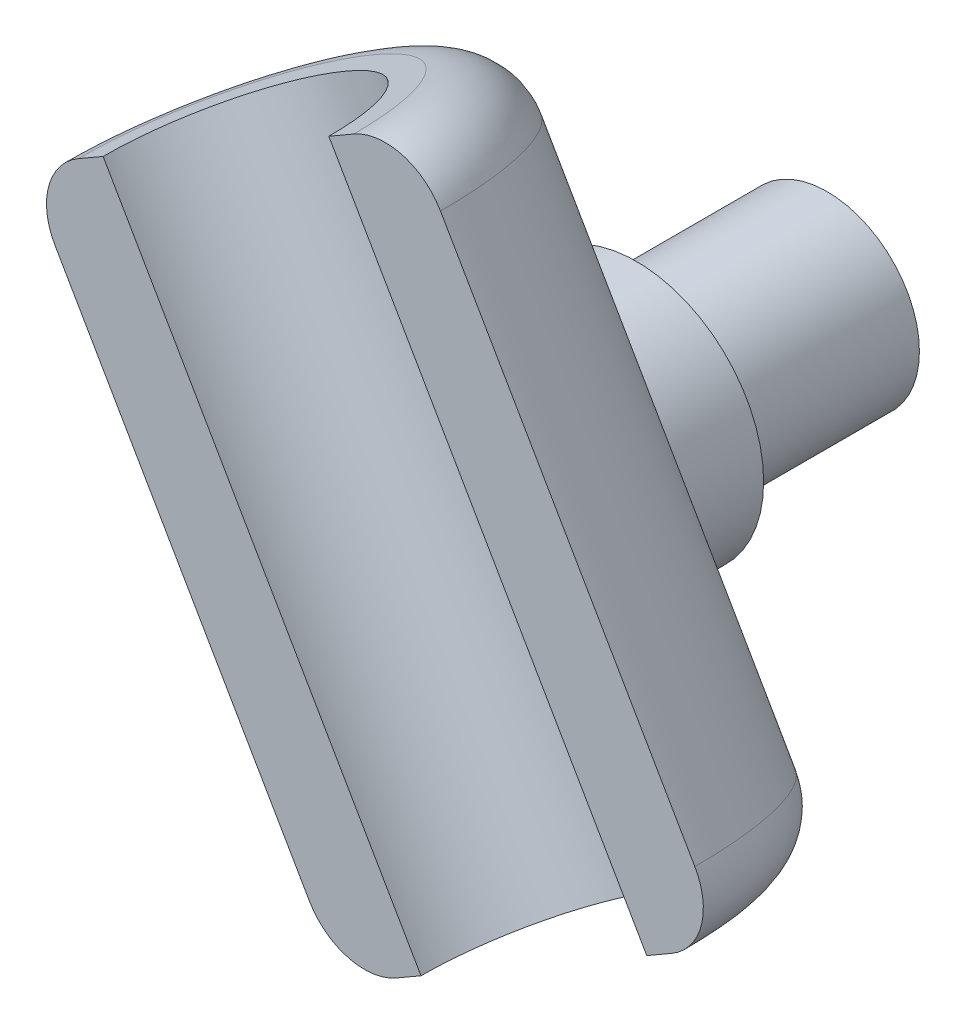
ISO-10303-21;
HEADER;
FILE_DESCRIPTION(('STEP AP214'),'2;1');
FILE_NAME('part.step','',(''),(''),'','','');
FILE_SCHEMA(('AUTOMOTIVE_DESIGN { 1 0 10303 214 1 1 1 1 }'));
ENDSEC;
DATA;
#1=APPLICATION_CONTEXT('core data for automotive mechanical design processes');
#2=APPLICATION_PROTOCOL_DEFINITION('international standard','automotive_design',2000,#1);
#3=PRODUCT_CONTEXT('',#1,'mechanical');
#4=PRODUCT('Part','Part','',(#3));
#5=PRODUCT_RELATED_PRODUCT_CATEGORY('part','',(#4));
#6=PRODUCT_DEFINITION_FORMATION('','',#4);
#7=PRODUCT_DEFINITION_CONTEXT('part definition',#1,'design');
#8=PRODUCT_DEFINITION('design','',#6,#7);
#9=PRODUCT_DEFINITION_SHAPE('','',#8);
#10=(LENGTH_UNIT() NAMED_UNIT(*) SI_UNIT(.MILLI.,.METRE.));
#11=(NAMED_UNIT(*) PLANE_ANGLE_UNIT() SI_UNIT($,.RADIAN.));
#12=(NAMED_UNIT(*) SI_UNIT($,.STERADIAN.) SOLID_ANGLE_UNIT());
#13=UNCERTAINTY_MEASURE_WITH_UNIT(LENGTH_MEASURE(1.E-05),#10,'distance_accuracy_value','');
#14=(GEOMETRIC_REPRESENTATION_CONTEXT(3) GLOBAL_UNCERTAINTY_ASSIGNED_CONTEXT((#13)) GLOBAL_UNIT_ASSIGNED_CONTEXT((#10,
#11,#12)) REPRESENTATION_CONTEXT('',''));
#15=CARTESIAN_POINT('',(0.,0.,0.));
#16=DIRECTION('',(0.,0.,1.));
#17=DIRECTION('',(1.,0.,0.));
#18=AXIS2_PLACEMENT_3D('',#15,#16,#17);
#19=CARTESIAN_POINT('',(0.,0.,8.02099309036844));
#20=DIRECTION('',(0.,0.,1.));
#21=DIRECTION('',(1.,0.,0.));
#22=AXIS2_PLACEMENT_3D('',#19,#20,#21);
#23=PLANE('',#22);
#24=DIRECTION('',(0.499999999999989,-0.866025403784445,0.));
#25=VECTOR('',#24,1.);
#26=CARTESIAN_POINT('',(-6.48868439169032,2.56315739652961,8.02099309036844));
#27=LINE('',#26,#25);
#28=CARTESIAN_POINT('',(1.24336641587843,-10.8291474488838,8.02099309036823));
#29=VERTEX_POINT('',#28);
#30=CARTESIAN_POINT('',(-8.75663358412135,6.49136062680508,8.0209930903685));
#31=VERTEX_POINT('',#30);
#32=EDGE_CURVE('E124',#29,#31,#27,.F.);
#33=ORIENTED_EDGE('',*,*,#32,.T.);
#34=DIRECTION('',(-0.866025403784445,-0.499999999999989,0.));
#35=VECTOR('',#34,1.);
#36=CARTESIAN_POINT('',(-5.20592942860133,8.54136062680722,8.02099309036844));
#37=LINE('',#36,#35);
#38=CARTESIAN_POINT('',(-9.53605644752356,6.04136062680728,8.02099309036855));
#39=VERTEX_POINT('',#38);
#40=EDGE_CURVE('E110',#31,#39,#37,.T.);
#41=ORIENTED_EDGE('',*,*,#40,.T.);
#42=CARTESIAN_POINT('',(-8.53605644752358,4.30930981923839,8.02099309036855));
#43=DIRECTION('',(0.,0.,1.));
#44=DIRECTION('',(1.,0.,0.));
#45=AXIS2_PLACEMENT_3D('',#42,#43,#44);
#46=CIRCLE('',#45,2.);
#47=CARTESIAN_POINT('',(-10.2681072550925,3.30930981923841,8.02099309036855));
#48=VERTEX_POINT('',#47);
#49=EDGE_CURVE('E172',#48,#39,#46,.F.);
#50=ORIENTED_EDGE('',*,*,#49,.F.);
#51=DIRECTION('',(0.499999999999989,-0.866025403784445,0.));
#52=VECTOR('',#51,1.);
#53=CARTESIAN_POINT('',(-11.2681072550924,5.0413606268073,8.02099309036844));
#54=LINE('',#53,#52);
#55=CARTESIAN_POINT('',(-2.26810725509265,-10.5470966413127,8.02099309036833));
#56=VERTEX_POINT('',#55);
#57=EDGE_CURVE('E120',#56,#48,#54,.F.);
#58=ORIENTED_EDGE('',*,*,#57,.F.);
#59=CARTESIAN_POINT('',(-0.536056447523757,-9.54709664131274,8.02099309036833));
#60=DIRECTION('',(0.,0.,1.));
#61=DIRECTION('',(1.,0.,0.));
#62=AXIS2_PLACEMENT_3D('',#59,#60,#61);
#63=CIRCLE('',#62,2.);
#64=CARTESIAN_POINT('',(0.46394355247622,-11.2791474488816,8.02099309036833));
#65=VERTEX_POINT('',#64);
#66=EDGE_CURVE('E71',#65,#56,#63,.F.);
#67=ORIENTED_EDGE('',*,*,#66,.F.);
#68=DIRECTION('',(-0.866025403784445,-0.499999999999989,0.));
#69=VECTOR('',#68,1.);
#70=CARTESIAN_POINT('',(4.79407057139845,-8.77914744888168,8.02099309036844));
#71=LINE('',#70,#69);
#72=EDGE_CURVE('E174',#29,#65,#71,.T.);
#73=ORIENTED_EDGE('',*,*,#72,.F.);
#74=EDGE_LOOP('',(#33,#41,#50,#58,#67,#73));
#75=FACE_BOUND('',#74,.T.);
#76=ADVANCED_FACE('F46',(#75),#23,.T.);
#77=CARTESIAN_POINT('',(0.124197590320872,9.30930981923827,8.02099309036855));
#78=DIRECTION('',(0.,0.,1.));
#79=DIRECTION('',(1.,0.,0.));
#80=AXIS2_PLACEMENT_3D('',#77,#78,#79);
#81=CIRCLE('',#80,2.);
#82=CARTESIAN_POINT('',(-0.875802409679106,11.0413606268072,8.02099309036855));
#83=VERTEX_POINT('',#82);
#84=CARTESIAN_POINT('',(1.85624839788976,10.3093098192383,8.02099309036855));
#85=VERTEX_POINT('',#84);
#86=EDGE_CURVE('E119',#83,#85,#81,.F.);
#87=ORIENTED_EDGE('',*,*,#86,.F.);
#88=CARTESIAN_POINT('',(-1.65522527308131,10.5913606268094,8.0209930903685));
#89=VERTEX_POINT('',#88);
#90=EDGE_CURVE('E107',#83,#89,#37,.T.);
#91=ORIENTED_EDGE('',*,*,#90,.T.);
#92=DIRECTION('',(0.499999999999989,-0.866025403784445,0.));
#93=VECTOR('',#92,1.);
#94=CARTESIAN_POINT('',(0.612723919349714,6.6631573965339,8.02099309036844));
#95=LINE('',#94,#93);
#96=CARTESIAN_POINT('',(8.34477472691846,-6.72914744887954,8.02099309036823));
#97=VERTEX_POINT('',#96);
#98=EDGE_CURVE('E118',#89,#97,#95,.T.);
#99=ORIENTED_EDGE('',*,*,#98,.T.);
#100=CARTESIAN_POINT('',(9.12419759032067,-6.27914744888174,8.02099309036833));
#101=VERTEX_POINT('',#100);
#102=EDGE_CURVE('E175',#101,#97,#71,.T.);
#103=ORIENTED_EDGE('',*,*,#102,.F.);
#104=CARTESIAN_POINT('',(8.12419759032069,-4.54709664131285,8.02099309036833));
#105=DIRECTION('',(0.,0.,1.));
#106=DIRECTION('',(1.,0.,0.));
#107=AXIS2_PLACEMENT_3D('',#104,#105,#106);
#108=CIRCLE('',#107,2.);
#109=CARTESIAN_POINT('',(9.85624839788958,-3.54709664131287,8.02099309036833));
#110=VERTEX_POINT('',#109);
#111=EDGE_CURVE('E63',#110,#101,#108,.F.);
#112=ORIENTED_EDGE('',*,*,#111,.F.);
#113=DIRECTION('',(0.499999999999989,-0.866025403784445,0.));
#114=VECTOR('',#113,1.);
#115=CARTESIAN_POINT('',(0.856248397889784,12.0413606268071,8.02099309036844));
#116=LINE('',#115,#114);
#117=EDGE_CURVE('E177',#85,#110,#116,.T.);
#118=ORIENTED_EDGE('',*,*,#117,.F.);
#119=EDGE_LOOP('',(#87,#91,#99,#103,#112,#118));
#120=FACE_BOUND('',#119,.T.);
#121=ADVANCED_FACE('F117',(#120),#23,.T.);
#122=CARTESIAN_POINT('',(0.,0.,-6.));
#123=DIRECTION('',(0.,0.,1.));
#124=DIRECTION('',(1.,0.,0.));
#125=AXIS2_PLACEMENT_3D('',#122,#123,#124);
#126=PLANE('',#125);
#127=CARTESIAN_POINT('',(0.,0.,-6.));
#128=DIRECTION('',(0.,0.,1.));
#129=DIRECTION('',(1.,0.,0.));
#130=AXIS2_PLACEMENT_3D('',#127,#128,#129);
#131=CIRCLE('',#130,1.80000000000001);
#132=CARTESIAN_POINT('',(1.80000000000001,0.,-6.));
#133=VERTEX_POINT('',#132);
#134=EDGE_CURVE('E138',#133,#133,#131,.T.);
#135=ORIENTED_EDGE('',*,*,#134,.T.);
#136=EDGE_LOOP('',(#135));
#137=FACE_BOUND('',#136,.T.);
#138=CARTESIAN_POINT('',(0.,0.,-6.));
#139=DIRECTION('',(0.,0.,1.));
#140=DIRECTION('',(1.,0.,0.));
#141=AXIS2_PLACEMENT_3D('',#138,#139,#140);
#142=CIRCLE('',#141,2.9);
#143=CARTESIAN_POINT('',(2.9,0.,-6.));
#144=VERTEX_POINT('',#143);
#145=EDGE_CURVE('E147',#144,#144,#142,.T.);
#146=ORIENTED_EDGE('',*,*,#145,.F.);
#147=EDGE_LOOP('',(#146));
#148=FACE_BOUND('',#147,.T.);
#149=ADVANCED_FACE('F195',(#137,#148),#126,.F.);
#150=CARTESIAN_POINT('',(0.,0.,-5.29999999999998));
#151=DIRECTION('',(0.,0.,-1.));
#152=DIRECTION('',(-1.,0.,0.));
#153=AXIS2_PLACEMENT_3D('',#150,#151,#152);
#154=CONICAL_SURFACE('',#153,1.6,0.278299659005109);
#155=ORIENTED_EDGE('',*,*,#134,.F.);
#156=EDGE_LOOP('',(#155));
#157=FACE_BOUND('',#156,.T.);
#158=CARTESIAN_POINT('',(0.,0.,-5.29999999999998));
#159=DIRECTION('',(0.,0.,1.));
#160=DIRECTION('',(1.,0.,0.));
#161=AXIS2_PLACEMENT_3D('',#158,#159,#160);
#162=CIRCLE('',#161,1.6);
#163=CARTESIAN_POINT('',(1.6,0.,-5.29999999999998));
#164=VERTEX_POINT('',#163);
#165=EDGE_CURVE('E142',#164,#164,#162,.F.);
#166=ORIENTED_EDGE('',*,*,#165,.F.);
#167=EDGE_LOOP('',(#166));
#168=FACE_BOUND('',#167,.T.);
#169=ADVANCED_FACE('F197',(#157,#168),#154,.F.);
#170=CARTESIAN_POINT('',(0.,0.,-6.));
#171=DIRECTION('',(0.,0.,1.));
#172=DIRECTION('',(1.,0.,0.));
#173=AXIS2_PLACEMENT_3D('',#170,#171,#172);
#174=CYLINDRICAL_SURFACE('',#173,2.9);
#175=ORIENTED_EDGE('',*,*,#145,.T.);
#176=EDGE_LOOP('',(#175));
#177=FACE_BOUND('',#176,.T.);
#178=CARTESIAN_POINT('',(0.,0.,0.));
#179=DIRECTION('',(0.,0.,1.));
#180=DIRECTION('',(1.,0.,0.));
#181=AXIS2_PLACEMENT_3D('',#178,#179,#180);
#182=CIRCLE('',#181,2.9);
#183=CARTESIAN_POINT('',(2.9,0.,0.));
#184=VERTEX_POINT('',#183);
#185=EDGE_CURVE('E156',#184,#184,#182,.T.);
#186=ORIENTED_EDGE('',*,*,#185,.F.);
#187=EDGE_LOOP('',(#186));
#188=FACE_BOUND('',#187,.T.);
#189=ADVANCED_FACE('F203',(#177,#188),#174,.T.);
#190=CARTESIAN_POINT('',(0.,0.,-1.5));
#191=DIRECTION('',(0.,0.,-1.));
#192=DIRECTION('',(-1.,0.,0.));
#193=AXIS2_PLACEMENT_3D('',#190,#191,#192);
#194=CYLINDRICAL_SURFACE('',#193,1.6);
#195=ORIENTED_EDGE('',*,*,#165,.T.);
#196=EDGE_LOOP('',(#195));
#197=FACE_BOUND('',#196,.T.);
#198=CARTESIAN_POINT('',(0.,0.,-1.5));
#199=DIRECTION('',(0.,0.,-1.));
#200=DIRECTION('',(-1.,0.,0.));
#201=AXIS2_PLACEMENT_3D('',#198,#199,#200);
#202=CIRCLE('',#201,1.6);
#203=CARTESIAN_POINT('',(-1.6,0.,-1.5));
#204=VERTEX_POINT('',#203);
#205=EDGE_CURVE('E164',#204,#204,#202,.T.);
#206=ORIENTED_EDGE('',*,*,#205,.F.);
#207=EDGE_LOOP('',(#206));
#208=FACE_BOUND('',#207,.T.);
#209=ADVANCED_FACE('F218',(#197,#208),#194,.F.);
#210=CARTESIAN_POINT('',(0.,0.,0.));
#211=DIRECTION('',(0.,0.,1.));
#212=DIRECTION('',(1.,0.,0.));
#213=AXIS2_PLACEMENT_3D('',#210,#211,#212);
#214=PLANE('',#213);
#215=ORIENTED_EDGE('',*,*,#185,.T.);
#216=EDGE_LOOP('',(#215));
#217=FACE_BOUND('',#216,.T.);
#218=CARTESIAN_POINT('',(0.,0.,0.));
#219=DIRECTION('',(0.,0.,1.));
#220=DIRECTION('',(1.,0.,0.));
#221=AXIS2_PLACEMENT_3D('',#218,#219,#220);
#222=CIRCLE('',#221,4.);
#223=CARTESIAN_POINT('',(4.,0.,0.));
#224=VERTEX_POINT('',#223);
#225=EDGE_CURVE('E159',#224,#224,#222,.T.);
#226=ORIENTED_EDGE('',*,*,#225,.F.);
#227=EDGE_LOOP('',(#226));
#228=FACE_BOUND('',#227,.T.);
#229=ADVANCED_FACE('F215',(#217,#228),#214,.F.);
#230=CARTESIAN_POINT('',(0.,0.,-1.5));
#231=DIRECTION('',(0.,0.,-1.));
#232=DIRECTION('',(-1.,0.,0.));
#233=AXIS2_PLACEMENT_3D('',#230,#231,#232);
#234=PLANE('',#233);
#235=CARTESIAN_POINT('',(0.,0.,-1.5));
#236=DIRECTION('',(0.,0.,-1.));
#237=DIRECTION('',(-1.,0.,0.));
#238=AXIS2_PLACEMENT_3D('',#235,#236,#237);
#239=CIRCLE('',#238,1.);
#240=CARTESIAN_POINT('',(-1.,0.,-1.5));
#241=VERTEX_POINT('',#240);
#242=EDGE_CURVE('E55',#241,#241,#239,.T.);
#243=ORIENTED_EDGE('',*,*,#242,.F.);
#244=EDGE_LOOP('',(#243));
#245=FACE_BOUND('',#244,.T.);
#246=ORIENTED_EDGE('',*,*,#205,.T.);
#247=EDGE_LOOP('',(#246));
#248=FACE_BOUND('',#247,.T.);
#249=ADVANCED_FACE('F213',(#245,#248),#234,.T.);
#250=CARTESIAN_POINT('',(0.,0.,8.));
#251=DIRECTION('',(0.,0.,-1.));
#252=DIRECTION('',(-1.,0.,0.));
#253=AXIS2_PLACEMENT_3D('',#250,#251,#252);
#254=CYLINDRICAL_SURFACE('',#253,4.);
#255=CARTESIAN_POINT('',(-4.,0.,1.80883623014193));
#256=CARTESIAN_POINT('',(-3.99999342598494,0.231308924283838,1.74877158407734));
#257=CARTESIAN_POINT('',(-3.97992440127598,0.461524914398632,1.68407635267823));
#258=CARTESIAN_POINT('',(-3.90076403049026,0.914974337038699,1.55351691720726));
#259=CARTESIAN_POINT('',(-3.84162167224292,1.13819824147697,1.48765129466767));
#260=CARTESIAN_POINT('',(-3.68481899134929,1.57338626082385,1.36211642783433));
#261=CARTESIAN_POINT('',(-3.58708456485081,1.78532781776501,1.30245938527888));
#262=CARTESIAN_POINT('',(-3.41277665386032,2.08965786411433,1.22303226278465));
#263=CARTESIAN_POINT('',(-3.35004301356529,2.18885353177109,1.19822953157543));
#264=CARTESIAN_POINT('',(-3.21560982475648,2.3819453956484,1.1527344764117));
#265=CARTESIAN_POINT('',(-3.14391537394391,2.47584456125648,1.13203983260232));
#266=CARTESIAN_POINT('',(-2.99645437736261,2.65210894391691,1.09654692423946));
#267=CARTESIAN_POINT('',(-2.92117623331387,2.73482774826274,1.08147320337636));
#268=CARTESIAN_POINT('',(-2.7635780331916,2.893988196289,1.0560968282406));
#269=CARTESIAN_POINT('',(-2.68126166942895,2.97043309056103,1.04579169030284));
#270=CARTESIAN_POINT('',(-2.51023199094068,3.11630606762672,1.03032796821086));
#271=CARTESIAN_POINT('',(-2.42152120667149,3.18573690024805,1.0251673600777));
#272=CARTESIAN_POINT('',(-2.2384583915259,3.31692333576816,1.02022390810533));
#273=CARTESIAN_POINT('',(-2.14410691675488,3.37867969343736,1.02044053500366));
#274=CARTESIAN_POINT('',(-1.9615640792878,3.48744188339078,1.02599146194175));
#275=CARTESIAN_POINT('',(-1.87387603815683,3.53532566923449,1.03074652905456));
#276=CARTESIAN_POINT('',(-1.69540416517169,3.62429993767695,1.04448887666628));
#277=CARTESIAN_POINT('',(-1.60461936685395,3.66538827565561,1.05347748982715));
#278=CARTESIAN_POINT('',(-1.42070003662915,3.74051764544517,1.07552893790777));
#279=CARTESIAN_POINT('',(-1.32756640174707,3.77456132323749,1.08859023848424));
#280=CARTESIAN_POINT('',(-1.1395812656622,3.8355097933376,1.1185385742695));
#281=CARTESIAN_POINT('',(-1.04472911469326,3.86241182258518,1.13542708553215));
#282=CARTESIAN_POINT('',(-0.759086514645732,3.93218257215284,1.19128113322491));
#283=CARTESIAN_POINT('',(-0.566598110466483,3.96436332769546,1.23551130613316));
#284=CARTESIAN_POINT('',(-0.181950238526502,4.00053939732916,1.33481183588112));
#285=CARTESIAN_POINT('',(0.0102091392108026,4.00452794563925,1.38988479159535));
#286=CARTESIAN_POINT('',(0.412072659006131,3.98434693289585,1.51375364969397));
#287=CARTESIAN_POINT('',(0.621357792727086,3.95700397273042,1.58339417847936));
#288=CARTESIAN_POINT('',(1.03212938707435,3.87025482756594,1.72619086023947));
#289=CARTESIAN_POINT('',(1.23360552458156,3.81080765440402,1.79935139828311));
#290=CARTESIAN_POINT('',(1.64913384726757,3.65179573336528,1.95179551895131));
#291=CARTESIAN_POINT('',(1.86180773160842,3.54828293881661,2.03076477416867));
#292=CARTESIAN_POINT('',(2.26862268980344,3.30296111375137,2.17586223512607));
#293=CARTESIAN_POINT('',(2.46279124321892,3.16121010327032,2.24200963665894));
#294=CARTESIAN_POINT('',(2.78210881420536,2.87985337086747,2.33760863867062));
#295=CARTESIAN_POINT('',(2.91259504925867,2.74801459128747,2.37206567769339));
#296=CARTESIAN_POINT('',(3.15528935294577,2.46550429015536,2.42315015073428));
#297=CARTESIAN_POINT('',(3.26752132006324,2.31485785610879,2.43980105847081));
#298=CARTESIAN_POINT('',(3.4702821884795,1.99814621503962,2.45288991323489));
#299=CARTESIAN_POINT('',(3.56074750778626,1.83203775625339,2.44926937591929));
#300=CARTESIAN_POINT('',(3.71688268552622,1.49002467881996,2.42223748952308));
#301=CARTESIAN_POINT('',(3.7825365371486,1.31411381994663,2.39881339585527));
#302=CARTESIAN_POINT('',(3.88643401100305,0.963367571515856,2.33648665003323));
#303=CARTESIAN_POINT('',(3.92547374489095,0.788671922896422,2.29809323813198));
#304=CARTESIAN_POINT('',(3.97984248892015,0.438509919177833,2.21003344465712));
#305=CARTESIAN_POINT('',(3.9951629893246,0.263043310112378,2.16036302456213));
#306=CARTESIAN_POINT('',(4.00351737348788,-0.114938638785424,2.04526328452225));
#307=CARTESIAN_POINT('',(3.99247707017206,-0.317162655524928,1.97858558296059));
#308=CARTESIAN_POINT('',(3.94045129034698,-0.716591558018577,1.84180908228655));
#309=CARTESIAN_POINT('',(3.8994383348503,-0.913791666039601,1.77170719894939));
#310=CARTESIAN_POINT('',(3.77891241234105,-1.33208527304234,1.62222578697201));
#311=CARTESIAN_POINT('',(3.69423319792388,-1.55186530081448,1.54318601680732));
#312=CARTESIAN_POINT('',(3.53809603165348,-1.86972133051856,1.43249252668126));
#313=CARTESIAN_POINT('',(3.48115539473178,-1.97376175209281,1.39688719686557));
#314=CARTESIAN_POINT('',(3.35769089733728,-2.17716361660807,1.3291670381234));
#315=CARTESIAN_POINT('',(3.29117244194172,-2.27652765689932,1.2970502583086));
#316=CARTESIAN_POINT('',(3.15099041274203,-2.46673611431222,1.23807148042188));
#317=CARTESIAN_POINT('',(3.07761049785274,-2.55774877886307,1.21107796044871));
#318=CARTESIAN_POINT('',(2.92247462873395,-2.73365731813629,1.16186514732349));
#319=CARTESIAN_POINT('',(2.8407232701545,-2.81855650581868,1.13964325523445));
#320=CARTESIAN_POINT('',(2.66941719802595,-2.98130142815468,1.10057012181142));
#321=CARTESIAN_POINT('',(2.57986887120462,-3.05915283118554,1.08371453651269));
#322=CARTESIAN_POINT('',(2.39364147189583,-3.20696198336692,1.05580849799616));
#323=CARTESIAN_POINT('',(2.29696355519689,-3.27692100733139,1.04475710620071));
#324=CARTESIAN_POINT('',(2.11098344517723,-3.39917559871271,1.029824488715));
#325=CARTESIAN_POINT('',(2.0224685622051,-3.45257927056299,1.02517203136416));
#326=CARTESIAN_POINT('',(1.84144246266811,-3.55243262039291,1.02045607545251));
#327=CARTESIAN_POINT('',(1.74893000506368,-3.59888011856386,1.02039401236196));
#328=CARTESIAN_POINT('',(1.56071882296443,-3.68440380029182,1.02480314480388));
#329=CARTESIAN_POINT('',(1.46502180659342,-3.72348386291826,1.0292719468153));
#330=CARTESIAN_POINT('',(1.27114971629451,-3.79405332764569,1.04255555877507));
#331=CARTESIAN_POINT('',(1.17297371336214,-3.8255398359735,1.05137202165771));
#332=CARTESIAN_POINT('',(0.885693684793269,-3.90559007629852,1.08287796605126));
#333=CARTESIAN_POINT('',(0.694242166067037,-3.94403531933141,1.11091263905164));
#334=CARTESIAN_POINT('',(0.310063211869727,-3.99267500331351,1.17899273416638));
#335=CARTESIAN_POINT('',(0.11733554691577,-4.00286421676642,1.21904037721733));
#336=CARTESIAN_POINT('',(-0.28080055711571,-3.99547983822031,1.31121919938739));
#337=CARTESIAN_POINT('',(-0.486002196891609,-3.97563989341073,1.36405689784006));
#338=CARTESIAN_POINT('',(-0.889680470867881,-3.9051911084511,1.47491318497924));
#339=CARTESIAN_POINT('',(-1.08815173390292,-3.85455827707176,1.53293578320444));
#340=CARTESIAN_POINT('',(-1.49748728394097,-3.71611105645858,1.65568540398464));
#341=CARTESIAN_POINT('',(-1.70713375529567,-3.62467646877478,1.72041244044152));
#342=CARTESIAN_POINT('',(-2.10973877396284,-3.40607626916892,1.84210962728158));
#343=CARTESIAN_POINT('',(-2.30269499480221,-3.27890568642877,1.89907869690653));
#344=CARTESIAN_POINT('',(-2.57490393012474,-3.06321132263967,1.97239182136585));
#345=CARTESIAN_POINT('',(-2.66267750707283,-2.98725924697086,1.99478715428871));
#346=CARTESIAN_POINT('',(-2.8318425693943,-2.82739888184291,2.03463261540095));
#347=CARTESIAN_POINT('',(-2.91323765465696,-2.74349514008702,2.05208554773096));
#348=CARTESIAN_POINT('',(-3.06870426966351,-2.56841325764603,2.08119641298522));
#349=CARTESIAN_POINT('',(-3.14278487557157,-2.4772443924673,2.09286160189035));
#350=CARTESIAN_POINT('',(-3.28287366750553,-2.28835234785242,2.10982170359163));
#351=CARTESIAN_POINT('',(-3.3488834281223,-2.19063045266634,2.11511786074856));
#352=CARTESIAN_POINT('',(-3.462945877361,-2.00451947304938,2.11876626215978));
#353=CARTESIAN_POINT('',(-3.51221054693868,-1.91688699283024,2.11802947345015));
#354=CARTESIAN_POINT('',(-3.603957215387,-1.73826777524859,2.11175985856842));
#355=CARTESIAN_POINT('',(-3.64643699721644,-1.64727995339464,2.10622546850556));
#356=CARTESIAN_POINT('',(-3.72429959877462,-1.46274288169591,2.09057756532434));
#357=CARTESIAN_POINT('',(-3.75968510288372,-1.36919461597504,2.08046578896448));
#358=CARTESIAN_POINT('',(-3.82322935860214,-1.18019909190634,2.05604771893694));
#359=CARTESIAN_POINT('',(-3.85138564113157,-1.08475119671726,2.04173999574353));
#360=CARTESIAN_POINT('',(-3.91745130511786,-0.825720167146491,1.99816506522922));
#361=CARTESIAN_POINT('',(-3.94852069411089,-0.660926764484696,1.96541506189726));
#362=CARTESIAN_POINT('',(-3.98979988441272,-0.330570298233066,1.89217549613179));
#363=CARTESIAN_POINT('',(-4.00000468965432,-0.165007059814516,1.85168408253934));
#364=CARTESIAN_POINT('',(-4.,0.,1.80883623014193));
#365=B_SPLINE_CURVE_WITH_KNOTS('',3,(#255,#256,#257,#258,#259,#260,#261,#262,#263,#264,#265,
#266,#267,#268,#269,#270,#271,#272,#273,#274,#275,#276,#277,#278,#279,#280,#281,#282,#283,#284,
#285,#286,#287,#288,#289,#290,#291,#292,#293,#294,#295,#296,#297,#298,#299,#300,#301,#302,#303,
#304,#305,#306,#307,#308,#309,#310,#311,#312,#313,#314,#315,#316,#317,#318,#319,#320,#321,#322,
#323,#324,#325,#326,#327,#328,#329,#330,#331,#332,#333,#334,#335,#336,#337,#338,#339,#340,#341,
#342,#343,#344,#345,#346,#347,#348,#349,#350,#351,#352,#353,#354,#355,#356,#357,#358,#359,#360,
#361,#362,#363,#364),.UNSPECIFIED.,.T.,.F.,(4,2,2,2,2,2,2,2,2,2,2,2,2,2,2,2,2,2,2,2,2,2,2,2,2,2,
2,2,2,2,2,2,2,2,2,2,2,2,2,2,2,2,2,2,2,2,2,2,2,2,2,2,2,2,4),(0.,0.716336607485053,
1.43361028085323,2.15226800168319,2.51172163246701,2.87097169714279,3.20906674851914,
3.54698550797209,3.8847712697135,4.22252378451486,4.52222991365216,4.82203044926725,
5.12171817428671,5.42152167823136,6.01915943206079,6.6169406066901,7.2810488595611,
7.94600700563508,8.69050253239759,9.43387470587847,9.99752319067382,10.5604277014836,
11.1249570610717,11.6898500005639,12.2370013592088,12.7843489736051,13.4216043013814,
14.0594446002116,14.8007564898068,15.1718469691717,15.5427288448643,15.9021714907426,
16.2614178615171,16.6203726826171,16.9792694403904,17.2893135104618,17.5994545345504,
17.9094318056976,18.2195270178608,18.808581946451,19.3977458456619,20.0336442305502,
20.6700386898589,21.3799662562588,22.0899926213371,22.4441853562917,22.798176730536,
23.1517231842102,23.5052005518958,23.8064109331867,24.1077195380075,24.4089139155811,
24.7102110271315,25.2210962189467,25.7321037289448),.UNSPECIFIED.);
#366=CARTESIAN_POINT('',(-4.,0.,1.80883623014193));
#367=VERTEX_POINT('',#366);
#368=EDGE_CURVE('E115',#367,#367,#365,.T.);
#369=ORIENTED_EDGE('',*,*,#368,.T.);
#370=EDGE_LOOP('',(#369));
#371=FACE_BOUND('',#370,.T.);
#372=ORIENTED_EDGE('',*,*,#225,.T.);
#373=EDGE_LOOP('',(#372));
#374=FACE_BOUND('',#373,.T.);
#375=ADVANCED_FACE('F209',(#371,#374),#254,.T.);
#376=CARTESIAN_POINT('',(-5.20592942860133,8.54136062680722,8.02099309036857));
#377=DIRECTION('',(0.499999999999989,-0.866025403784445,0.));
#378=DIRECTION('',(0.866025403784445,0.499999999999989,0.));
#379=AXIS2_PLACEMENT_3D('',#376,#377,#378);
#380=PLANE('',#379);
#381=ORIENTED_EDGE('',*,*,#90,.F.);
#382=CARTESIAN_POINT('',(-5.20592942860133,8.54136062680722,8.02099309036857));
#383=DIRECTION('',(0.499999999999989,-0.866025403784445,0.));
#384=DIRECTION('',(0.866025403784445,0.499999999999989,0.));
#385=AXIS2_PLACEMENT_3D('',#382,#383,#384);
#386=CIRCLE('',#385,5.);
#387=EDGE_CURVE('E131',#83,#39,#386,.F.);
#388=ORIENTED_EDGE('',*,*,#387,.T.);
#389=ORIENTED_EDGE('',*,*,#40,.F.);
#390=CARTESIAN_POINT('',(-5.20592942860133,8.54136062680722,8.02099309036857));
#391=DIRECTION('',(0.499999999999989,-0.866025403784445,0.));
#392=DIRECTION('',(0.866025403784445,0.499999999999989,0.));
#393=AXIS2_PLACEMENT_3D('',#390,#391,#392);
#394=CIRCLE('',#393,4.1);
#395=EDGE_CURVE('E103',#31,#89,#394,.T.);
#396=ORIENTED_EDGE('',*,*,#395,.T.);
#397=EDGE_LOOP('',(#381,#388,#389,#396));
#398=FACE_BOUND('',#397,.T.);
#399=ADVANCED_FACE('F105',(#398),#380,.F.);
#400=CARTESIAN_POINT('',(-5.20592942860133,8.54136062680722,8.02099309036857));
#401=DIRECTION('',(0.499999999999989,-0.866025403784445,0.));
#402=DIRECTION('',(0.866025403784445,0.499999999999989,0.));
#403=AXIS2_PLACEMENT_3D('',#400,#401,#402);
#404=CYLINDRICAL_SURFACE('',#403,7.);
#405=ORIENTED_EDGE('',*,*,#368,.F.);
#406=EDGE_LOOP('',(#405));
#407=FACE_BOUND('',#406,.T.);
#408=CARTESIAN_POINT('',(3.79407057139847,-7.04709664131279,8.02099309036833));
#409=DIRECTION('',(0.499999999999989,-0.866025403784445,0.));
#410=DIRECTION('',(0.866025403784445,0.499999999999989,0.));
#411=AXIS2_PLACEMENT_3D('',#408,#409,#410);
#412=CIRCLE('',#411,7.);
#413=EDGE_CURVE('E136',#110,#56,#412,.F.);
#414=ORIENTED_EDGE('',*,*,#413,.T.);
#415=ORIENTED_EDGE('',*,*,#57,.T.);
#416=CARTESIAN_POINT('',(-4.20592942860135,6.80930981923833,8.02099309036855));
#417=DIRECTION('',(0.499999999999989,-0.866025403784445,0.));
#418=DIRECTION('',(0.866025403784445,0.499999999999989,0.));
#419=AXIS2_PLACEMENT_3D('',#416,#417,#418);
#420=CIRCLE('',#419,7.);
#421=EDGE_CURVE('E133',#48,#85,#420,.T.);
#422=ORIENTED_EDGE('',*,*,#421,.T.);
#423=ORIENTED_EDGE('',*,*,#117,.T.);
#424=EDGE_LOOP('',(#414,#415,#422,#423));
#425=FACE_BOUND('',#424,.T.);
#426=ADVANCED_FACE('F184',(#407,#425),#404,.T.);
#427=CARTESIAN_POINT('',(4.79407057139845,-8.77914744888168,8.0209930903683));
#428=DIRECTION('',(0.499999999999989,-0.866025403784445,0.));
#429=DIRECTION('',(0.866025403784445,0.499999999999989,0.));
#430=AXIS2_PLACEMENT_3D('',#427,#428,#429);
#431=PLANE('',#430);
#432=CARTESIAN_POINT('',(4.79407057139845,-8.77914744888168,8.0209930903683));
#433=DIRECTION('',(0.499999999999989,-0.866025403784445,0.));
#434=DIRECTION('',(0.866025403784445,0.499999999999989,0.));
#435=AXIS2_PLACEMENT_3D('',#432,#433,#434);
#436=CIRCLE('',#435,5.);
#437=EDGE_CURVE('E128',#65,#101,#436,.T.);
#438=ORIENTED_EDGE('',*,*,#437,.T.);
#439=ORIENTED_EDGE('',*,*,#102,.T.);
#440=CARTESIAN_POINT('',(4.79407057139845,-8.77914744888168,8.0209930903683));
#441=DIRECTION('',(0.499999999999989,-0.866025403784445,0.));
#442=DIRECTION('',(0.866025403784445,0.499999999999989,0.));
#443=AXIS2_PLACEMENT_3D('',#440,#441,#442);
#444=CIRCLE('',#443,4.1);
#445=EDGE_CURVE('E50',#29,#97,#444,.T.);
#446=ORIENTED_EDGE('',*,*,#445,.F.);
#447=ORIENTED_EDGE('',*,*,#72,.T.);
#448=EDGE_LOOP('',(#438,#439,#446,#447));
#449=FACE_BOUND('',#448,.T.);
#450=ADVANCED_FACE('F187',(#449),#431,.T.);
#451=CARTESIAN_POINT('',(3.79407057139847,-7.04709664131279,8.02099309036833));
#452=DIRECTION('',(0.499999999999989,-0.866025403784445,0.));
#453=DIRECTION('',(0.866025403784445,0.499999999999989,0.));
#454=AXIS2_PLACEMENT_3D('',#451,#452,#453);
#455=TOROIDAL_SURFACE('',#454,5.,2.);
#456=ORIENTED_EDGE('',*,*,#437,.F.);
#457=ORIENTED_EDGE('',*,*,#66,.T.);
#458=ORIENTED_EDGE('',*,*,#413,.F.);
#459=ORIENTED_EDGE('',*,*,#111,.T.);
#460=EDGE_LOOP('',(#456,#457,#458,#459));
#461=FACE_BOUND('',#460,.T.);
#462=ADVANCED_FACE('F48',(#461),#455,.T.);
#463=CARTESIAN_POINT('',(-4.20592942860135,6.80930981923833,8.02099309036855));
#464=DIRECTION('',(0.499999999999989,-0.866025403784445,0.));
#465=DIRECTION('',(0.866025403784445,0.499999999999989,0.));
#466=AXIS2_PLACEMENT_3D('',#463,#464,#465);
#467=TOROIDAL_SURFACE('',#466,5.,2.);
#468=ORIENTED_EDGE('',*,*,#421,.F.);
#469=ORIENTED_EDGE('',*,*,#49,.T.);
#470=ORIENTED_EDGE('',*,*,#387,.F.);
#471=ORIENTED_EDGE('',*,*,#86,.T.);
#472=EDGE_LOOP('',(#468,#469,#470,#471));
#473=FACE_BOUND('',#472,.T.);
#474=ADVANCED_FACE('F183',(#473),#467,.T.);
#475=CARTESIAN_POINT('',(0.,0.,15.0209930903686));
#476=DIRECTION('',(0.,0.,-1.));
#477=DIRECTION('',(-1.,0.,0.));
#478=AXIS2_PLACEMENT_3D('',#475,#476,#477);
#479=CYLINDRICAL_SURFACE('',#478,1.);
#480=ORIENTED_EDGE('',*,*,#242,.T.);
#481=EDGE_LOOP('',(#480));
#482=FACE_BOUND('',#481,.T.);
#483=CARTESIAN_POINT('',(-1.,0.,3.96941114198252));
#484=CARTESIAN_POINT('',(-0.999998560688023,0.0562500511277149,3.96504998640268));
#485=CARTESIAN_POINT('',(-0.99524166585288,0.112493656973956,3.96034815872546));
#486=CARTESIAN_POINT('',(-0.976348525521477,0.22341127214801,3.9509509703167));
#487=CARTESIAN_POINT('',(-0.96220593549265,0.278084193626551,3.946255616114));
#488=CARTESIAN_POINT('',(-0.924905861399373,0.384342455705609,3.93759081947313));
#489=CARTESIAN_POINT('',(-0.901746820445711,0.435927261298979,3.93362150257539));
#490=CARTESIAN_POINT('',(-0.847032394795285,0.534521736217533,3.9270794244975));
#491=CARTESIAN_POINT('',(-0.815479097805958,0.581532539162748,3.92450631655389));
#492=CARTESIAN_POINT('',(-0.745227980383791,0.669144785148907,3.92131307560186));
#493=CARTESIAN_POINT('',(-0.706608248102713,0.709808059913379,3.92067281933127));
#494=CARTESIAN_POINT('',(-0.623138656894295,0.784103975254637,3.92162018310614));
#495=CARTESIAN_POINT('',(-0.578289488087719,0.817737393593346,3.92320755654338));
#496=CARTESIAN_POINT('',(-0.484623612747413,0.876434041271093,3.92864573251027));
#497=CARTESIAN_POINT('',(-0.43589924471646,0.901648944085591,3.93245264383614));
#498=CARTESIAN_POINT('',(-0.335168971504036,0.943738225589626,3.94213701157884));
#499=CARTESIAN_POINT('',(-0.283162943157102,0.960612291025258,3.94801454574712));
#500=CARTESIAN_POINT('',(-0.176913736119311,0.985750888608692,3.96151603477775));
#501=CARTESIAN_POINT('',(-0.122656606610416,0.993949305361909,3.96915286842091));
#502=CARTESIAN_POINT('',(-0.0137049765463312,1.00139665941931,3.98558671333036));
#503=CARTESIAN_POINT('',(0.0409896048395368,1.00064390270957,3.9943839438908));
#504=CARTESIAN_POINT('',(0.151140556370961,0.990106923378759,4.01273296494374));
#505=CARTESIAN_POINT('',(0.206567743294949,0.98004263973887,4.02229971141422));
#506=CARTESIAN_POINT('',(0.315012266726215,0.950748465821092,4.041102792532));
#507=CARTESIAN_POINT('',(0.368029257808903,0.931517266266379,4.05033907977837));
#508=CARTESIAN_POINT('',(0.470948909722831,0.884003651095096,4.06774162805175));
#509=CARTESIAN_POINT('',(0.520798995851171,0.85560092243574,4.07589150843938));
#510=CARTESIAN_POINT('',(0.615104253328563,0.790522951850729,4.09012818436239));
#511=CARTESIAN_POINT('',(0.659560736294651,0.753849727371715,4.096215482125));
#512=CARTESIAN_POINT('',(0.740418402749007,0.674457469091937,4.10550917582106));
#513=CARTESIAN_POINT('',(0.777022679239078,0.631955034384381,4.10879719591552));
#514=CARTESIAN_POINT('',(0.842654756373015,0.541350128612128,4.11243272851635));
#515=CARTESIAN_POINT('',(0.871684519387106,0.493249112681429,4.11278100337293));
#516=CARTESIAN_POINT('',(0.920344199532251,0.39480341005111,4.11054296079633));
#517=CARTESIAN_POINT('',(0.940283480386212,0.344608641063887,4.10806527280362));
#518=CARTESIAN_POINT('',(0.97180342597297,0.241841410174178,4.10061001294025));
#519=CARTESIAN_POINT('',(0.983383638326924,0.189268819751552,4.09563230579744));
#520=CARTESIAN_POINT('',(0.998029969046117,0.0827611578912673,4.08362261568135));
#521=CARTESIAN_POINT('',(1.00102795209791,0.028818594675989,4.07657468023204));
#522=CARTESIAN_POINT('',(0.998351113844539,-0.0786518298328954,4.0611004172596));
#523=CARTESIAN_POINT('',(0.992674383882233,-0.132179597256234,4.05267378675283));
#524=CARTESIAN_POINT('',(0.972444260091934,-0.239725797000884,4.03481211761975));
#525=CARTESIAN_POINT('',(0.957532212861335,-0.293672380864966,4.02534974103452));
#526=CARTESIAN_POINT('',(0.91892571297433,-0.398357714429943,4.00656073699256));
#527=CARTESIAN_POINT('',(0.895229929078197,-0.449095976520987,3.99723413033554));
#528=CARTESIAN_POINT('',(0.839037804105597,-0.547054990851893,3.97931200897396));
#529=CARTESIAN_POINT('',(0.806367584287698,-0.594179849171688,3.97073589078535));
#530=CARTESIAN_POINT('',(0.73329521314229,-0.682314753504541,3.95525188886712));
#531=CARTESIAN_POINT('',(0.692894249776228,-0.723325737298964,3.9483437491924));
#532=CARTESIAN_POINT('',(0.6064106671707,-0.797137436012237,3.93683923777565));
#533=CARTESIAN_POINT('',(0.560468609632065,-0.830095480317962,3.93219642945208));
#534=CARTESIAN_POINT('',(0.463559947844115,-0.887858393909796,3.92525819633634));
#535=CARTESIAN_POINT('',(0.412594250414832,-0.912664731174217,3.92296234874066));
#536=CARTESIAN_POINT('',(0.308651544576323,-0.952759339764464,3.92073418511625));
#537=CARTESIAN_POINT('',(0.255771260773617,-0.968295420992894,3.9207372832926));
#538=CARTESIAN_POINT('',(0.14821542029785,-0.990478369295529,3.92269419326378));
#539=CARTESIAN_POINT('',(0.093539835855665,-0.99712509880572,3.92464803524582));
#540=CARTESIAN_POINT('',(-0.0161716813690204,-1.00137788559479,3.9300646123921));
#541=CARTESIAN_POINT('',(-0.0712080588907,-0.998969057015673,3.93352982372967));
#542=CARTESIAN_POINT('',(-0.180079340493438,-0.98518180497031,3.94138446207918));
#543=CARTESIAN_POINT('',(-0.23391408849776,-0.973802223206274,3.94577400838701));
#544=CARTESIAN_POINT('',(-0.340087311181701,-0.942058868168356,3.95491833465098));
#545=CARTESIAN_POINT('',(-0.392370094930078,-0.921510252394478,3.9596788740069));
#546=CARTESIAN_POINT('',(-0.492796277502858,-0.871944651727452,3.96878177440977));
#547=CARTESIAN_POINT('',(-0.540939588963978,-0.842927488162942,3.97312412663114));
#548=CARTESIAN_POINT('',(-0.63203594586125,-0.776988717042903,3.98078872802469));
#549=CARTESIAN_POINT('',(-0.674954421944296,-0.740018515376032,3.98410438564073));
#550=CARTESIAN_POINT('',(-0.753988195821444,-0.659310965180842,3.98919232922928));
#551=CARTESIAN_POINT('',(-0.790103554905903,-0.615573677624738,3.99096462910667));
#552=CARTESIAN_POINT('',(-0.853973528125249,-0.523290318971087,3.99269200240168));
#553=CARTESIAN_POINT('',(-0.881842815706305,-0.474824033274788,3.99267330323557));
#554=CARTESIAN_POINT('',(-0.929106577832771,-0.373976471653869,3.99088614687627));
#555=CARTESIAN_POINT('',(-0.948505965206158,-0.321597485931769,3.98911870596079));
#556=CARTESIAN_POINT('',(-0.975548972602726,-0.224404281644185,3.98456102303999));
#557=CARTESIAN_POINT('',(-0.984706795295377,-0.179991900288831,3.98202171418932));
#558=CARTESIAN_POINT('',(-0.996933016047637,-0.0903849813238239,3.97619863148255));
#559=CARTESIAN_POINT('',(-1.00000115632072,-0.0451904106844653,3.9729148261172));
#560=CARTESIAN_POINT('',(-1.,0.,3.96941114198252));
#561=B_SPLINE_CURVE_WITH_KNOTS('',3,(#483,#484,#485,#486,#487,#488,#489,#490,#491,#492,#493,
#494,#495,#496,#497,#498,#499,#500,#501,#502,#503,#504,#505,#506,#507,#508,#509,#510,#511,#512,
#513,#514,#515,#516,#517,#518,#519,#520,#521,#522,#523,#524,#525,#526,#527,#528,#529,#530,#531,
#532,#533,#534,#535,#536,#537,#538,#539,#540,#541,#542,#543,#544,#545,#546,#547,#548,#549,#550,
#551,#552,#553,#554,#555,#556,#557,#558,#559,#560),.UNSPECIFIED.,.T.,.F.,(4,2,2,2,2,2,2,2,2,2,2,
2,2,2,2,2,2,2,2,2,2,2,2,2,2,2,2,2,2,2,2,2,2,2,2,2,2,2,4),(0.,0.16909392617935,0.338302272883289,
0.507539850109711,0.676735376107834,0.844163195149979,1.01157248067111,1.17577844179866,
1.33999056948345,1.50544530619173,1.67093135578744,1.84156237309894,2.01221776831553,
2.18520955863577,2.35815919611074,2.52587386224312,2.6935450343884,2.85498203453739,
3.01642777073264,3.17915173586846,3.34191150956431,3.51142675494505,3.68096770211577,
3.85405851724856,4.02712275533574,4.19647239437314,4.36579151980091,4.53035403701206,
4.69491910082269,4.85975480090967,5.02461178796121,5.19295389479942,5.3612995536148,
5.53070462458163,5.70010816927836,5.8670313507859,6.03385758216926,6.16969924562245,
6.3055466593598),.UNSPECIFIED.);
#562=CARTESIAN_POINT('',(-1.,0.,3.96941114198252));
#563=VERTEX_POINT('',#562);
#564=EDGE_CURVE('E11',#563,#563,#561,.T.);
#565=ORIENTED_EDGE('',*,*,#564,.F.);
#566=EDGE_LOOP('',(#565));
#567=FACE_BOUND('',#566,.T.);
#568=ADVANCED_FACE('F193',(#482,#567),#479,.F.);
#569=CARTESIAN_POINT('',(-2.9379802361703,4.61315739653176,8.02099309036851));
#570=DIRECTION('',(0.499999999999989,-0.866025403784445,0.));
#571=DIRECTION('',(0.866025403784445,0.499999999999989,0.));
#572=AXIS2_PLACEMENT_3D('',#569,#570,#571);
#573=CYLINDRICAL_SURFACE('',#572,4.10000000000438);
#574=ORIENTED_EDGE('',*,*,#564,.T.);
#575=EDGE_LOOP('',(#574));
#576=FACE_BOUND('',#575,.T.);
#577=ORIENTED_EDGE('',*,*,#32,.F.);
#578=ORIENTED_EDGE('',*,*,#445,.T.);
#579=ORIENTED_EDGE('',*,*,#98,.F.);
#580=ORIENTED_EDGE('',*,*,#395,.F.);
#581=EDGE_LOOP('',(#577,#578,#579,#580));
#582=FACE_BOUND('',#581,.T.);
#583=ADVANCED_FACE('F122',(#576,#582),#573,.F.);
#584=CLOSED_SHELL('',(#76,#121,#149,#169,#189,#209,#229,#249,#375,#399,#426,#450,#462,#474,#568,#583));
#585=MANIFOLD_SOLID_BREP('B2',#584);
#586=ADVANCED_BREP_SHAPE_REPRESENTATION('',(#18,#585),#14);
#587=SHAPE_DEFINITION_REPRESENTATION(#9,#586);
ENDSEC;
END-ISO-10303-21;
